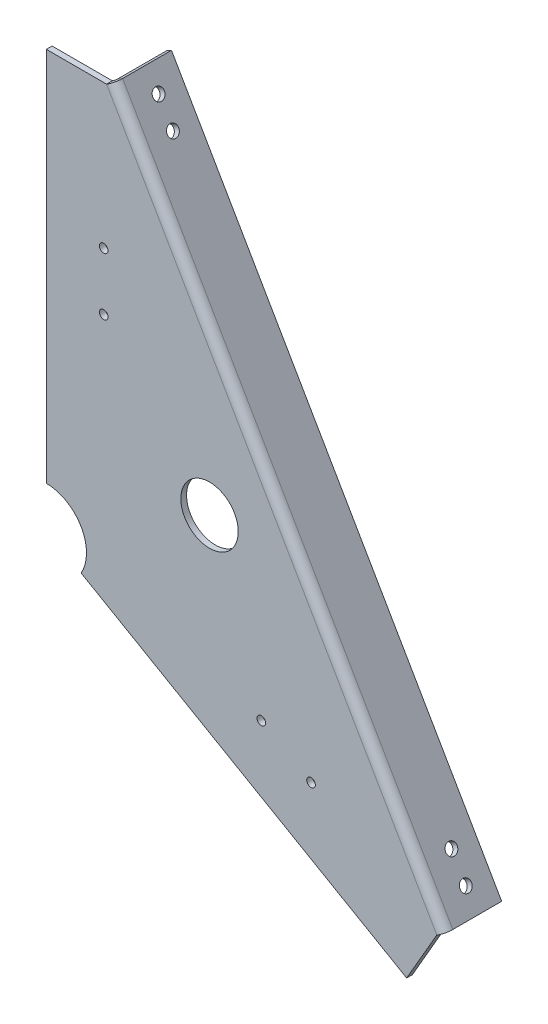
ISO-10303-21;
HEADER;
FILE_DESCRIPTION(('STEP AP214'),'2;1');
FILE_NAME('part.step','',(''),(''),'','','');
FILE_SCHEMA(('AUTOMOTIVE_DESIGN { 1 0 10303 214 1 1 1 1 }'));
ENDSEC;
DATA;
#1=APPLICATION_CONTEXT('core data for automotive mechanical design processes');
#2=APPLICATION_PROTOCOL_DEFINITION('international standard','automotive_design',2000,#1);
#3=PRODUCT_CONTEXT('',#1,'mechanical');
#4=PRODUCT('Part','Part','',(#3));
#5=PRODUCT_RELATED_PRODUCT_CATEGORY('part','',(#4));
#6=PRODUCT_DEFINITION_FORMATION('','',#4);
#7=PRODUCT_DEFINITION_CONTEXT('part definition',#1,'design');
#8=PRODUCT_DEFINITION('design','',#6,#7);
#9=PRODUCT_DEFINITION_SHAPE('','',#8);
#10=(LENGTH_UNIT() NAMED_UNIT(*) SI_UNIT(.MILLI.,.METRE.));
#11=(NAMED_UNIT(*) PLANE_ANGLE_UNIT() SI_UNIT($,.RADIAN.));
#12=(NAMED_UNIT(*) SI_UNIT($,.STERADIAN.) SOLID_ANGLE_UNIT());
#13=UNCERTAINTY_MEASURE_WITH_UNIT(LENGTH_MEASURE(1.E-05),#10,'distance_accuracy_value','');
#14=(GEOMETRIC_REPRESENTATION_CONTEXT(3) GLOBAL_UNCERTAINTY_ASSIGNED_CONTEXT((#13)) GLOBAL_UNIT_ASSIGNED_CONTEXT((#10,
#11,#12)) REPRESENTATION_CONTEXT('',''));
#15=CARTESIAN_POINT('',(0.,0.,0.));
#16=DIRECTION('',(0.,0.,1.));
#17=DIRECTION('',(1.,0.,0.));
#18=AXIS2_PLACEMENT_3D('',#15,#16,#17);
#19=CARTESIAN_POINT('',(93.9999999999978,235.558909829368,-2.));
#20=DIRECTION('',(0.,1.,0.));
#21=DIRECTION('',(-1.,0.,0.));
#22=AXIS2_PLACEMENT_3D('',#19,#20,#21);
#23=PLANE('',#22);
#24=DIRECTION('',(-1.,0.,0.));
#25=VECTOR('',#24,1.);
#26=CARTESIAN_POINT('',(93.9999999999978,235.558909829368,-2.));
#27=LINE('',#26,#25);
#28=CARTESIAN_POINT('',(135.999999999997,235.558909829367,-1.99999999999968));
#29=VERTEX_POINT('',#28);
#30=CARTESIAN_POINT('',(115.008517475188,235.558909829368,-2.));
#31=VERTEX_POINT('',#30);
#32=EDGE_CURVE('E213',#29,#31,#27,.T.);
#33=ORIENTED_EDGE('',*,*,#32,.T.);
#34=DIRECTION('',(0.,0.,1.));
#35=VECTOR('',#34,1.);
#36=CARTESIAN_POINT('',(115.008517475188,235.558909829368,-2.));
#37=LINE('',#36,#35);
#38=CARTESIAN_POINT('',(115.008517475188,235.558909829368,0.));
#39=VERTEX_POINT('',#38);
#40=EDGE_CURVE('E363',#31,#39,#37,.T.);
#41=ORIENTED_EDGE('',*,*,#40,.T.);
#42=DIRECTION('',(-1.,0.,0.));
#43=VECTOR('',#42,1.);
#44=CARTESIAN_POINT('',(93.9999999999978,235.558909829368,0.));
#45=LINE('',#44,#43);
#46=CARTESIAN_POINT('',(135.999999999998,235.558909829367,0.));
#47=VERTEX_POINT('',#46);
#48=EDGE_CURVE('E207',#47,#39,#45,.T.);
#49=ORIENTED_EDGE('',*,*,#48,.F.);
#50=DIRECTION('',(0.,0.,1.));
#51=VECTOR('',#50,1.);
#52=CARTESIAN_POINT('',(135.999999999998,235.558909829367,-2.));
#53=LINE('',#52,#51);
#54=EDGE_CURVE('E220',#29,#47,#53,.T.);
#55=ORIENTED_EDGE('',*,*,#54,.F.);
#56=EDGE_LOOP('',(#33,#41,#49,#55));
#57=FACE_BOUND('',#56,.T.);
#58=ADVANCED_FACE('F101',(#57),#23,.T.);
#59=CARTESIAN_POINT('',(250.999999999999,36.3730669589471,-2.));
#60=DIRECTION('',(0.866025403784455,-0.499999999999971,0.));
#61=DIRECTION('',(0.499999999999971,0.866025403784455,0.));
#62=AXIS2_PLACEMENT_3D('',#59,#60,#61);
#63=PLANE('',#62);
#64=DIRECTION('',(0.499999999999971,0.866025403784455,0.));
#65=VECTOR('',#64,1.);
#66=CARTESIAN_POINT('',(250.999999999999,36.3730669589471,0.));
#67=LINE('',#66,#65);
#68=CARTESIAN_POINT('',(240.504258737599,18.1939098293726,0.));
#69=VERTEX_POINT('',#68);
#70=CARTESIAN_POINT('',(250.999999999998,36.3730669589468,3.17454396103756E-13));
#71=VERTEX_POINT('',#70);
#72=EDGE_CURVE('E190',#69,#71,#67,.T.);
#73=ORIENTED_EDGE('',*,*,#72,.F.);
#74=DIRECTION('',(0.,0.,-1.));
#75=VECTOR('',#74,1.);
#76=CARTESIAN_POINT('',(240.504258737599,18.1939098293726,-2.));
#77=LINE('',#76,#75);
#78=CARTESIAN_POINT('',(240.504258737599,18.1939098293726,-2.));
#79=VERTEX_POINT('',#78);
#80=EDGE_CURVE('E176',#69,#79,#77,.T.);
#81=ORIENTED_EDGE('',*,*,#80,.T.);
#82=DIRECTION('',(0.499999999999971,0.866025403784455,0.));
#83=VECTOR('',#82,1.);
#84=CARTESIAN_POINT('',(250.999999999999,36.3730669589471,-2.));
#85=LINE('',#84,#83);
#86=CARTESIAN_POINT('',(250.999999999999,36.3730669589471,-1.99999999999968));
#87=VERTEX_POINT('',#86);
#88=EDGE_CURVE('E219',#79,#87,#85,.T.);
#89=ORIENTED_EDGE('',*,*,#88,.T.);
#90=DIRECTION('',(0.,0.,1.));
#91=VECTOR('',#90,1.);
#92=CARTESIAN_POINT('',(250.999999999999,36.3730669589471,-2.));
#93=LINE('',#92,#91);
#94=EDGE_CURVE('E200',#87,#71,#93,.T.);
#95=ORIENTED_EDGE('',*,*,#94,.T.);
#96=EDGE_LOOP('',(#73,#81,#89,#95));
#97=FACE_BOUND('',#96,.T.);
#98=ADVANCED_FACE('F103',(#97),#63,.T.);
#99=CARTESIAN_POINT('',(0.,0.,-2.));
#100=DIRECTION('',(0.,0.,-1.));
#101=DIRECTION('',(-1.,0.,0.));
#102=AXIS2_PLACEMENT_3D('',#99,#100,#101);
#103=PLANE('',#102);
#104=CARTESIAN_POINT('',(171.849364905387,123.465988394157,-2.));
#105=DIRECTION('',(0.,0.,1.));
#106=DIRECTION('',(1.,0.,0.));
#107=AXIS2_PLACEMENT_3D('',#104,#105,#106);
#108=CIRCLE('',#107,10.);
#109=CARTESIAN_POINT('',(181.849364905387,123.465988394157,-2.));
#110=VERTEX_POINT('',#109);
#111=EDGE_CURVE('E203',#110,#110,#108,.T.);
#112=ORIENTED_EDGE('',*,*,#111,.T.);
#113=EDGE_LOOP('',(#112));
#114=FACE_BOUND('',#113,.T.);
#115=CARTESIAN_POINT('',(189.878221735088,70.5070415551599,-2.));
#116=DIRECTION('',(0.,0.,-1.));
#117=DIRECTION('',(-1.,0.,0.));
#118=AXIS2_PLACEMENT_3D('',#115,#116,#117);
#119=CIRCLE('',#118,1.50000000000139);
#120=CARTESIAN_POINT('',(188.378221735087,70.5070415551599,-2.));
#121=VERTEX_POINT('',#120);
#122=EDGE_CURVE('E184',#121,#121,#119,.T.);
#123=ORIENTED_EDGE('',*,*,#122,.F.);
#124=EDGE_LOOP('',(#123));
#125=FACE_BOUND('',#124,.T.);
#126=CARTESIAN_POINT('',(207.198729810778,60.5070415551598,-2.));
#127=DIRECTION('',(0.,0.,-1.));
#128=DIRECTION('',(-1.,0.,0.));
#129=AXIS2_PLACEMENT_3D('',#126,#127,#128);
#130=CIRCLE('',#129,1.50000000000002);
#131=CARTESIAN_POINT('',(205.698729810778,60.5070415551598,-2.));
#132=VERTEX_POINT('',#131);
#133=EDGE_CURVE('E376',#132,#132,#130,.T.);
#134=ORIENTED_EDGE('',*,*,#133,.F.);
#135=EDGE_LOOP('',(#134));
#136=FACE_BOUND('',#135,.T.);
#137=CARTESIAN_POINT('',(135.,165.558909829367,-2.));
#138=DIRECTION('',(0.,0.,-1.));
#139=DIRECTION('',(-1.,0.,0.));
#140=AXIS2_PLACEMENT_3D('',#137,#138,#139);
#141=CIRCLE('',#140,1.5);
#142=CARTESIAN_POINT('',(133.5,165.558909829367,-2.));
#143=VERTEX_POINT('',#142);
#144=EDGE_CURVE('E377',#143,#143,#141,.T.);
#145=ORIENTED_EDGE('',*,*,#144,.F.);
#146=EDGE_LOOP('',(#145));
#147=FACE_BOUND('',#146,.T.);
#148=CARTESIAN_POINT('',(135.,185.558909829367,-2.));
#149=DIRECTION('',(0.,0.,-1.));
#150=DIRECTION('',(-1.,0.,0.));
#151=AXIS2_PLACEMENT_3D('',#148,#149,#150);
#152=CIRCLE('',#151,1.5);
#153=CARTESIAN_POINT('',(133.5,185.558909829367,-2.));
#154=VERTEX_POINT('',#153);
#155=EDGE_CURVE('E231',#154,#154,#152,.T.);
#156=ORIENTED_EDGE('',*,*,#155,.F.);
#157=EDGE_LOOP('',(#156));
#158=FACE_BOUND('',#157,.T.);
#159=ORIENTED_EDGE('',*,*,#88,.F.);
#160=DIRECTION('',(-0.866025403784457,0.499999999999968,0.));
#161=VECTOR('',#160,1.);
#162=CARTESIAN_POINT('',(68.0042587375918,117.786831264579,-2.));
#163=LINE('',#162,#161);
#164=CARTESIAN_POINT('',(127.128612146727,83.6513699081551,-2.));
#165=VERTEX_POINT('',#164);
#166=EDGE_CURVE('E179',#79,#165,#163,.T.);
#167=ORIENTED_EDGE('',*,*,#166,.T.);
#168=CARTESIAN_POINT('',(115.,90.643992262771,-2.));
#169=DIRECTION('',(0.,0.,-1.));
#170=DIRECTION('',(-1.,0.,0.));
#171=AXIS2_PLACEMENT_3D('',#168,#169,#170);
#172=CIRCLE('',#171,14.);
#173=CARTESIAN_POINT('',(115.008517475193,104.643989671793,-2.));
#174=VERTEX_POINT('',#173);
#175=EDGE_CURVE('E242',#174,#165,#172,.T.);
#176=ORIENTED_EDGE('',*,*,#175,.F.);
#177=DIRECTION('',(0.,1.,0.));
#178=VECTOR('',#177,1.);
#179=CARTESIAN_POINT('',(115.008517475197,4.01250439725282E-12,-2.));
#180=LINE('',#179,#178);
#181=EDGE_CURVE('E124',#174,#31,#180,.T.);
#182=ORIENTED_EDGE('',*,*,#181,.T.);
#183=ORIENTED_EDGE('',*,*,#32,.F.);
#184=DIRECTION('',(-0.500000000000004,0.866025403784436,0.));
#185=VECTOR('',#184,1.);
#186=CARTESIAN_POINT('',(135.999999999998,235.558909829367,-2.));
#187=LINE('',#186,#185);
#188=EDGE_CURVE('E353',#87,#29,#187,.T.);
#189=ORIENTED_EDGE('',*,*,#188,.F.);
#190=EDGE_LOOP('',(#159,#167,#176,#182,#183,#189));
#191=FACE_BOUND('',#190,.T.);
#192=ADVANCED_FACE('F365',(#114,#125,#136,#147,#158,#191),#103,.T.);
#193=CARTESIAN_POINT('',(0.,0.,0.));
#194=DIRECTION('',(0.,0.,-1.));
#195=DIRECTION('',(-1.,0.,0.));
#196=AXIS2_PLACEMENT_3D('',#193,#194,#195);
#197=PLANE('',#196);
#198=CARTESIAN_POINT('',(171.849364905387,123.465988394157,0.));
#199=DIRECTION('',(0.,0.,1.));
#200=DIRECTION('',(1.,0.,0.));
#201=AXIS2_PLACEMENT_3D('',#198,#199,#200);
#202=CIRCLE('',#201,10.);
#203=CARTESIAN_POINT('',(181.849364905387,123.465988394157,0.));
#204=VERTEX_POINT('',#203);
#205=EDGE_CURVE('E210',#204,#204,#202,.T.);
#206=ORIENTED_EDGE('',*,*,#205,.F.);
#207=EDGE_LOOP('',(#206));
#208=FACE_BOUND('',#207,.T.);
#209=CARTESIAN_POINT('',(189.878221735088,70.5070415551599,0.));
#210=DIRECTION('',(0.,0.,-1.));
#211=DIRECTION('',(-1.,0.,0.));
#212=AXIS2_PLACEMENT_3D('',#209,#210,#211);
#213=CIRCLE('',#212,1.50000000000139);
#214=CARTESIAN_POINT('',(188.378221735087,70.5070415551599,0.));
#215=VERTEX_POINT('',#214);
#216=EDGE_CURVE('E226',#215,#215,#213,.T.);
#217=ORIENTED_EDGE('',*,*,#216,.T.);
#218=EDGE_LOOP('',(#217));
#219=FACE_BOUND('',#218,.T.);
#220=CARTESIAN_POINT('',(207.198729810778,60.5070415551598,0.));
#221=DIRECTION('',(0.,0.,-1.));
#222=DIRECTION('',(-1.,0.,0.));
#223=AXIS2_PLACEMENT_3D('',#220,#221,#222);
#224=CIRCLE('',#223,1.50000000000002);
#225=CARTESIAN_POINT('',(205.698729810778,60.5070415551598,0.));
#226=VERTEX_POINT('',#225);
#227=EDGE_CURVE('E230',#226,#226,#224,.T.);
#228=ORIENTED_EDGE('',*,*,#227,.T.);
#229=EDGE_LOOP('',(#228));
#230=FACE_BOUND('',#229,.T.);
#231=CARTESIAN_POINT('',(135.,165.558909829367,0.));
#232=DIRECTION('',(0.,0.,-1.));
#233=DIRECTION('',(-1.,0.,0.));
#234=AXIS2_PLACEMENT_3D('',#231,#232,#233);
#235=CIRCLE('',#234,1.5);
#236=CARTESIAN_POINT('',(133.5,165.558909829367,0.));
#237=VERTEX_POINT('',#236);
#238=EDGE_CURVE('E235',#237,#237,#235,.T.);
#239=ORIENTED_EDGE('',*,*,#238,.T.);
#240=EDGE_LOOP('',(#239));
#241=FACE_BOUND('',#240,.T.);
#242=CARTESIAN_POINT('',(135.,185.558909829367,0.));
#243=DIRECTION('',(0.,0.,-1.));
#244=DIRECTION('',(-1.,0.,0.));
#245=AXIS2_PLACEMENT_3D('',#242,#243,#244);
#246=CIRCLE('',#245,1.5);
#247=CARTESIAN_POINT('',(133.5,185.558909829367,0.));
#248=VERTEX_POINT('',#247);
#249=EDGE_CURVE('E239',#248,#248,#246,.T.);
#250=ORIENTED_EDGE('',*,*,#249,.T.);
#251=EDGE_LOOP('',(#250));
#252=FACE_BOUND('',#251,.T.);
#253=DIRECTION('',(-0.866025403784457,0.499999999999968,0.));
#254=VECTOR('',#253,1.);
#255=CARTESIAN_POINT('',(244.834385756521,15.6939098293728,0.));
#256=LINE('',#255,#254);
#257=CARTESIAN_POINT('',(127.128612146727,83.6513699081551,0.));
#258=VERTEX_POINT('',#257);
#259=EDGE_CURVE('E116',#69,#258,#256,.T.);
#260=ORIENTED_EDGE('',*,*,#259,.F.);
#261=ORIENTED_EDGE('',*,*,#72,.T.);
#262=DIRECTION('',(-0.500000000000004,0.866025403784436,0.));
#263=VECTOR('',#262,1.);
#264=CARTESIAN_POINT('',(135.999999999998,235.558909829367,0.));
#265=LINE('',#264,#263);
#266=EDGE_CURVE('E202',#71,#47,#265,.T.);
#267=ORIENTED_EDGE('',*,*,#266,.T.);
#268=ORIENTED_EDGE('',*,*,#48,.T.);
#269=DIRECTION('',(0.,1.,0.));
#270=VECTOR('',#269,1.);
#271=CARTESIAN_POINT('',(115.008517475193,90.648909829368,0.));
#272=LINE('',#271,#270);
#273=CARTESIAN_POINT('',(115.008517475193,104.643989671793,0.));
#274=VERTEX_POINT('',#273);
#275=EDGE_CURVE('E196',#274,#39,#272,.T.);
#276=ORIENTED_EDGE('',*,*,#275,.F.);
#277=CARTESIAN_POINT('',(115.,90.643992262771,0.));
#278=DIRECTION('',(0.,0.,-1.));
#279=DIRECTION('',(-1.,0.,0.));
#280=AXIS2_PLACEMENT_3D('',#277,#278,#279);
#281=CIRCLE('',#280,14.);
#282=EDGE_CURVE('E194',#258,#274,#281,.F.);
#283=ORIENTED_EDGE('',*,*,#282,.F.);
#284=EDGE_LOOP('',(#260,#261,#267,#268,#276,#283));
#285=FACE_BOUND('',#284,.T.);
#286=ADVANCED_FACE('F188',(#208,#219,#230,#241,#252,#285),#197,.F.);
#287=CARTESIAN_POINT('',(115.,90.643992262771,0.00100000000031759));
#288=DIRECTION('',(0.,0.,-1.));
#289=DIRECTION('',(-1.,0.,0.));
#290=AXIS2_PLACEMENT_3D('',#287,#288,#289);
#291=CYLINDRICAL_SURFACE('',#290,14.);
#292=DIRECTION('',(0.,0.,-1.));
#293=VECTOR('',#292,1.);
#294=CARTESIAN_POINT('',(127.128612146727,83.6513699081551,0.00100000000031759));
#295=LINE('',#294,#293);
#296=EDGE_CURVE('E13',#258,#165,#295,.T.);
#297=ORIENTED_EDGE('',*,*,#296,.F.);
#298=ORIENTED_EDGE('',*,*,#282,.T.);
#299=DIRECTION('',(0.,0.,-1.));
#300=VECTOR('',#299,1.);
#301=CARTESIAN_POINT('',(115.008517475193,104.643989671793,0.00100000000031759));
#302=LINE('',#301,#300);
#303=EDGE_CURVE('E110',#174,#274,#302,.F.);
#304=ORIENTED_EDGE('',*,*,#303,.F.);
#305=ORIENTED_EDGE('',*,*,#175,.T.);
#306=EDGE_LOOP('',(#297,#298,#304,#305));
#307=FACE_BOUND('',#306,.T.);
#308=ADVANCED_FACE('F252',(#307),#291,.F.);
#309=CARTESIAN_POINT('',(171.849364905387,123.465988394157,-2.));
#310=DIRECTION('',(0.,0.,1.));
#311=DIRECTION('',(1.,0.,0.));
#312=AXIS2_PLACEMENT_3D('',#309,#310,#311);
#313=CYLINDRICAL_SURFACE('',#312,10.);
#314=ORIENTED_EDGE('',*,*,#111,.F.);
#315=EDGE_LOOP('',(#314));
#316=FACE_BOUND('',#315,.T.);
#317=ORIENTED_EDGE('',*,*,#205,.T.);
#318=EDGE_LOOP('',(#317));
#319=FACE_BOUND('',#318,.T.);
#320=ADVANCED_FACE('F428',(#316,#319),#313,.F.);
#321=CARTESIAN_POINT('',(135.999999999997,235.558909829367,-3.00000000000001));
#322=DIRECTION('',(-0.500000000000007,0.866025403784435,0.));
#323=DIRECTION('',(-0.866025403784435,-0.500000000000007,0.));
#324=AXIS2_PLACEMENT_3D('',#321,#322,#323);
#325=PLANE('',#324);
#326=DIRECTION('',(-0.866025403784436,-0.500000000000004,0.));
#327=VECTOR('',#326,1.);
#328=CARTESIAN_POINT('',(138.598076211351,237.058909829367,-3.));
#329=LINE('',#328,#327);
#330=CARTESIAN_POINT('',(136.866025403782,236.058909829367,-3.));
#331=VERTEX_POINT('',#330);
#332=CARTESIAN_POINT('',(138.598076211351,237.058909829368,-3.));
#333=VERTEX_POINT('',#332);
#334=EDGE_CURVE('E273',#331,#333,#329,.F.);
#335=ORIENTED_EDGE('',*,*,#334,.F.);
#336=CARTESIAN_POINT('',(135.999999999997,235.558909829367,-3.00000000000001));
#337=DIRECTION('',(0.500000000000007,-0.866025403784435,0.));
#338=DIRECTION('',(0.866025403784435,0.500000000000007,0.));
#339=AXIS2_PLACEMENT_3D('',#336,#337,#338);
#340=CIRCLE('',#339,1.00000000000032);
#341=EDGE_CURVE('E342',#29,#331,#340,.F.);
#342=ORIENTED_EDGE('',*,*,#341,.F.);
#343=ORIENTED_EDGE('',*,*,#54,.T.);
#344=CARTESIAN_POINT('',(135.999999999997,235.558909829367,-3.00000000000001));
#345=DIRECTION('',(0.500000000000007,-0.866025403784435,0.));
#346=DIRECTION('',(0.866025403784435,0.500000000000007,0.));
#347=AXIS2_PLACEMENT_3D('',#344,#345,#346);
#348=CIRCLE('',#347,3.00000000000032);
#349=EDGE_CURVE('E334',#47,#333,#348,.F.);
#350=ORIENTED_EDGE('',*,*,#349,.T.);
#351=EDGE_LOOP('',(#335,#342,#343,#350));
#352=FACE_BOUND('',#351,.T.);
#353=ADVANCED_FACE('F510',(#352),#325,.T.);
#354=CARTESIAN_POINT('',(250.999999999999,36.3730669589472,-3.00000000000001));
#355=DIRECTION('',(-0.500000000000007,0.866025403784435,0.));
#356=DIRECTION('',(-0.866025403784435,-0.500000000000007,0.));
#357=AXIS2_PLACEMENT_3D('',#354,#355,#356);
#358=PLANE('',#357);
#359=CARTESIAN_POINT('',(250.999999999999,36.3730669589472,-3.00000000000001));
#360=DIRECTION('',(0.500000000000007,-0.866025403784435,0.));
#361=DIRECTION('',(0.866025403784435,0.500000000000007,0.));
#362=AXIS2_PLACEMENT_3D('',#359,#360,#361);
#363=CIRCLE('',#362,1.00000000000032);
#364=CARTESIAN_POINT('',(251.866025403784,36.8730669589474,-3.));
#365=VERTEX_POINT('',#364);
#366=EDGE_CURVE('E296',#365,#87,#363,.T.);
#367=ORIENTED_EDGE('',*,*,#366,.F.);
#368=DIRECTION('',(-0.866025403784436,-0.500000000000004,0.));
#369=VECTOR('',#368,1.);
#370=CARTESIAN_POINT('',(251.866025403783,36.8730669589471,-3.));
#371=LINE('',#370,#369);
#372=CARTESIAN_POINT('',(253.598076211352,37.8730669589471,-3.));
#373=VERTEX_POINT('',#372);
#374=EDGE_CURVE('E324',#365,#373,#371,.F.);
#375=ORIENTED_EDGE('',*,*,#374,.T.);
#376=CARTESIAN_POINT('',(250.999999999999,36.3730669589473,-3.00000000000001));
#377=DIRECTION('',(0.500000000000007,-0.866025403784435,0.));
#378=DIRECTION('',(0.866025403784435,0.500000000000007,0.));
#379=AXIS2_PLACEMENT_3D('',#376,#377,#378);
#380=CIRCLE('',#379,3.00000000000032);
#381=EDGE_CURVE('E338',#373,#71,#380,.T.);
#382=ORIENTED_EDGE('',*,*,#381,.T.);
#383=ORIENTED_EDGE('',*,*,#94,.F.);
#384=EDGE_LOOP('',(#367,#375,#382,#383));
#385=FACE_BOUND('',#384,.T.);
#386=ADVANCED_FACE('F506',(#385),#358,.F.);
#387=CARTESIAN_POINT('',(250.999999999999,36.3730669589472,-3.00000000000001));
#388=DIRECTION('',(0.500000000000007,-0.866025403784435,0.));
#389=DIRECTION('',(0.866025403784435,0.500000000000007,0.));
#390=AXIS2_PLACEMENT_3D('',#387,#388,#389);
#391=CYLINDRICAL_SURFACE('',#390,3.00000000000032);
#392=ORIENTED_EDGE('',*,*,#266,.F.);
#393=ORIENTED_EDGE('',*,*,#381,.F.);
#394=DIRECTION('',(0.500000000000004,-0.866025403784436,0.));
#395=VECTOR('',#394,1.);
#396=CARTESIAN_POINT('',(138.598076211351,237.058909829367,-3.));
#397=LINE('',#396,#395);
#398=EDGE_CURVE('E321',#373,#333,#397,.F.);
#399=ORIENTED_EDGE('',*,*,#398,.T.);
#400=ORIENTED_EDGE('',*,*,#349,.F.);
#401=EDGE_LOOP('',(#392,#393,#399,#400));
#402=FACE_BOUND('',#401,.T.);
#403=ADVANCED_FACE('F503',(#402),#391,.T.);
#404=CARTESIAN_POINT('',(250.999999999999,36.3730669589472,-3.00000000000001));
#405=DIRECTION('',(0.500000000000007,-0.866025403784435,0.));
#406=DIRECTION('',(0.866025403784435,0.500000000000007,0.));
#407=AXIS2_PLACEMENT_3D('',#404,#405,#406);
#408=CYLINDRICAL_SURFACE('',#407,1.00000000000032);
#409=ORIENTED_EDGE('',*,*,#188,.T.);
#410=ORIENTED_EDGE('',*,*,#341,.T.);
#411=DIRECTION('',(0.500000000000004,-0.866025403784436,0.));
#412=VECTOR('',#411,1.);
#413=CARTESIAN_POINT('',(136.866025403782,236.058909829367,-3.));
#414=LINE('',#413,#412);
#415=EDGE_CURVE('E328',#331,#365,#414,.T.);
#416=ORIENTED_EDGE('',*,*,#415,.T.);
#417=ORIENTED_EDGE('',*,*,#366,.T.);
#418=EDGE_LOOP('',(#409,#410,#416,#417));
#419=FACE_BOUND('',#418,.T.);
#420=ADVANCED_FACE('F501',(#419),#408,.F.);
#421=CARTESIAN_POINT('',(253.598076211352,37.8730669589469,-20.));
#422=DIRECTION('',(-0.500000000000004,0.866025403784436,0.));
#423=DIRECTION('',(-0.866025403784436,-0.500000000000004,0.));
#424=AXIS2_PLACEMENT_3D('',#421,#422,#423);
#425=PLANE('',#424);
#426=ORIENTED_EDGE('',*,*,#374,.F.);
#427=DIRECTION('',(0.,0.,1.));
#428=VECTOR('',#427,1.);
#429=CARTESIAN_POINT('',(251.866025403783,36.8730669589469,-20.));
#430=LINE('',#429,#428);
#431=CARTESIAN_POINT('',(251.866025403783,36.8730669589469,-20.));
#432=VERTEX_POINT('',#431);
#433=EDGE_CURVE('E318',#365,#432,#430,.F.);
#434=ORIENTED_EDGE('',*,*,#433,.T.);
#435=DIRECTION('',(-0.866025403784436,-0.500000000000004,0.));
#436=VECTOR('',#435,1.);
#437=CARTESIAN_POINT('',(253.598076211352,37.8730669589469,-20.));
#438=LINE('',#437,#436);
#439=CARTESIAN_POINT('',(253.598076211352,37.8730669589469,-20.));
#440=VERTEX_POINT('',#439);
#441=EDGE_CURVE('E292',#440,#432,#438,.T.);
#442=ORIENTED_EDGE('',*,*,#441,.F.);
#443=DIRECTION('',(0.,0.,-1.));
#444=VECTOR('',#443,1.);
#445=CARTESIAN_POINT('',(253.598076211352,37.8730669589471,1.99268098573483E-12));
#446=LINE('',#445,#444);
#447=EDGE_CURVE('E308',#373,#440,#446,.T.);
#448=ORIENTED_EDGE('',*,*,#447,.F.);
#449=EDGE_LOOP('',(#426,#434,#442,#448));
#450=FACE_BOUND('',#449,.T.);
#451=ADVANCED_FACE('F494',(#450),#425,.F.);
#452=CARTESIAN_POINT('',(138.598076211351,237.058909829367,-1.99999999999999));
#453=DIRECTION('',(0.500000000000004,-0.866025403784436,0.));
#454=DIRECTION('',(0.866025403784436,0.500000000000004,0.));
#455=AXIS2_PLACEMENT_3D('',#452,#453,#454);
#456=PLANE('',#455);
#457=ORIENTED_EDGE('',*,*,#334,.T.);
#458=DIRECTION('',(0.,0.,1.));
#459=VECTOR('',#458,1.);
#460=CARTESIAN_POINT('',(138.598076211351,237.058909829367,7.76587597985664E-13));
#461=LINE('',#460,#459);
#462=CARTESIAN_POINT('',(138.598076211351,237.058909829367,-20.));
#463=VERTEX_POINT('',#462);
#464=EDGE_CURVE('E301',#463,#333,#461,.T.);
#465=ORIENTED_EDGE('',*,*,#464,.F.);
#466=DIRECTION('',(-0.866025403784436,-0.500000000000004,0.));
#467=VECTOR('',#466,1.);
#468=CARTESIAN_POINT('',(138.598076211351,237.058909829367,-20.));
#469=LINE('',#468,#467);
#470=CARTESIAN_POINT('',(136.866025403782,236.058909829367,-20.));
#471=VERTEX_POINT('',#470);
#472=EDGE_CURVE('E297',#463,#471,#469,.T.);
#473=ORIENTED_EDGE('',*,*,#472,.T.);
#474=DIRECTION('',(0.,0.,-1.));
#475=VECTOR('',#474,1.);
#476=CARTESIAN_POINT('',(136.866025403782,236.058909829367,-2.));
#477=LINE('',#476,#475);
#478=EDGE_CURVE('E311',#471,#331,#477,.F.);
#479=ORIENTED_EDGE('',*,*,#478,.T.);
#480=EDGE_LOOP('',(#457,#465,#473,#479));
#481=FACE_BOUND('',#480,.T.);
#482=ADVANCED_FACE('F487',(#481),#456,.F.);
#483=CARTESIAN_POINT('',(206.598076211352,119.279454914684,8.04683248923081E-13));
#484=DIRECTION('',(-0.866025403784436,-0.500000000000004,0.));
#485=DIRECTION('',(0.500000000000004,-0.866025403784436,0.));
#486=AXIS2_PLACEMENT_3D('',#483,#484,#485);
#487=PLANE('',#486);
#488=CARTESIAN_POINT('',(249.598076211352,44.8012701892222,-11.5));
#489=DIRECTION('',(0.866025403784436,0.500000000000005,0.));
#490=DIRECTION('',(-0.500000000000005,0.866025403784436,0.));
#491=AXIS2_PLACEMENT_3D('',#488,#489,#490);
#492=CIRCLE('',#491,2.);
#493=CARTESIAN_POINT('',(248.598076211352,46.5333209967911,-11.5));
#494=VERTEX_POINT('',#493);
#495=EDGE_CURVE('E268',#494,#494,#492,.T.);
#496=ORIENTED_EDGE('',*,*,#495,.F.);
#497=EDGE_LOOP('',(#496));
#498=FACE_BOUND('',#497,.T.);
#499=CARTESIAN_POINT('',(244.598076211352,53.4615242270666,-11.5));
#500=DIRECTION('',(0.866025403784436,0.500000000000005,0.));
#501=DIRECTION('',(-0.500000000000005,0.866025403784436,0.));
#502=AXIS2_PLACEMENT_3D('',#499,#500,#501);
#503=CIRCLE('',#502,2.);
#504=CARTESIAN_POINT('',(243.598076211352,55.1935750346355,-11.5));
#505=VERTEX_POINT('',#504);
#506=EDGE_CURVE('E269',#505,#505,#503,.T.);
#507=ORIENTED_EDGE('',*,*,#506,.F.);
#508=EDGE_LOOP('',(#507));
#509=FACE_BOUND('',#508,.T.);
#510=CARTESIAN_POINT('',(147.598076211352,221.470452561246,-11.5));
#511=DIRECTION('',(0.866025403784436,0.500000000000005,0.));
#512=DIRECTION('',(-0.500000000000005,0.866025403784436,0.));
#513=AXIS2_PLACEMENT_3D('',#510,#511,#512);
#514=CIRCLE('',#513,2.00000000000001);
#515=CARTESIAN_POINT('',(146.598076211352,223.202503368815,-11.5));
#516=VERTEX_POINT('',#515);
#517=EDGE_CURVE('E278',#516,#516,#514,.T.);
#518=ORIENTED_EDGE('',*,*,#517,.F.);
#519=EDGE_LOOP('',(#518));
#520=FACE_BOUND('',#519,.T.);
#521=CARTESIAN_POINT('',(142.598076211352,230.130706599091,-11.5));
#522=DIRECTION('',(0.866025403784436,0.500000000000005,0.));
#523=DIRECTION('',(-0.500000000000005,0.866025403784436,0.));
#524=AXIS2_PLACEMENT_3D('',#521,#522,#523);
#525=CIRCLE('',#524,2.);
#526=CARTESIAN_POINT('',(141.598076211352,231.862757406659,-11.5));
#527=VERTEX_POINT('',#526);
#528=EDGE_CURVE('E259',#527,#527,#525,.T.);
#529=ORIENTED_EDGE('',*,*,#528,.F.);
#530=EDGE_LOOP('',(#529));
#531=FACE_BOUND('',#530,.T.);
#532=ORIENTED_EDGE('',*,*,#398,.F.);
#533=ORIENTED_EDGE('',*,*,#447,.T.);
#534=DIRECTION('',(-0.500000000000004,0.866025403784436,0.));
#535=VECTOR('',#534,1.);
#536=CARTESIAN_POINT('',(206.598076211352,119.279454914684,-20.));
#537=LINE('',#536,#535);
#538=EDGE_CURVE('E305',#440,#463,#537,.T.);
#539=ORIENTED_EDGE('',*,*,#538,.T.);
#540=ORIENTED_EDGE('',*,*,#464,.T.);
#541=EDGE_LOOP('',(#532,#533,#539,#540));
#542=FACE_BOUND('',#541,.T.);
#543=ADVANCED_FACE('F483',(#498,#509,#520,#531,#542),#487,.F.);
#544=CARTESIAN_POINT('',(204.866025403783,118.279454914684,7.97700286245395E-13));
#545=DIRECTION('',(-0.866025403784436,-0.500000000000004,0.));
#546=DIRECTION('',(0.500000000000004,-0.866025403784436,0.));
#547=AXIS2_PLACEMENT_3D('',#544,#545,#546);
#548=PLANE('',#547);
#549=CARTESIAN_POINT('',(247.866025403784,43.8012701892222,-11.5));
#550=DIRECTION('',(-0.866025403784436,-0.500000000000004,0.));
#551=DIRECTION('',(0.500000000000004,-0.866025403784436,0.));
#552=AXIS2_PLACEMENT_3D('',#549,#550,#551);
#553=CIRCLE('',#552,2.);
#554=CARTESIAN_POINT('',(248.866025403784,42.0692193816533,-11.5));
#555=VERTEX_POINT('',#554);
#556=EDGE_CURVE('E264',#555,#555,#553,.F.);
#557=ORIENTED_EDGE('',*,*,#556,.T.);
#558=EDGE_LOOP('',(#557));
#559=FACE_BOUND('',#558,.T.);
#560=CARTESIAN_POINT('',(242.866025403783,52.4615242270666,-11.5));
#561=DIRECTION('',(-0.866025403784436,-0.500000000000004,0.));
#562=DIRECTION('',(0.500000000000004,-0.866025403784436,0.));
#563=AXIS2_PLACEMENT_3D('',#560,#561,#562);
#564=CIRCLE('',#563,2.);
#565=CARTESIAN_POINT('',(243.866025403783,50.7294734194977,-11.5));
#566=VERTEX_POINT('',#565);
#567=EDGE_CURVE('E274',#566,#566,#564,.F.);
#568=ORIENTED_EDGE('',*,*,#567,.T.);
#569=EDGE_LOOP('',(#568));
#570=FACE_BOUND('',#569,.T.);
#571=CARTESIAN_POINT('',(145.866025403783,220.470452561246,-11.5));
#572=DIRECTION('',(-0.866025403784436,-0.500000000000004,0.));
#573=DIRECTION('',(0.500000000000004,-0.866025403784436,0.));
#574=AXIS2_PLACEMENT_3D('',#571,#572,#573);
#575=CIRCLE('',#574,2.00000000000001);
#576=CARTESIAN_POINT('',(146.866025403783,218.738401753677,-11.5));
#577=VERTEX_POINT('',#576);
#578=EDGE_CURVE('E285',#577,#577,#575,.F.);
#579=ORIENTED_EDGE('',*,*,#578,.T.);
#580=EDGE_LOOP('',(#579));
#581=FACE_BOUND('',#580,.T.);
#582=CARTESIAN_POINT('',(140.866025403783,229.130706599091,-11.5));
#583=DIRECTION('',(-0.866025403784436,-0.500000000000004,0.));
#584=DIRECTION('',(0.500000000000004,-0.866025403784436,0.));
#585=AXIS2_PLACEMENT_3D('',#582,#583,#584);
#586=CIRCLE('',#585,2.);
#587=CARTESIAN_POINT('',(141.866025403783,227.398655791522,-11.5));
#588=VERTEX_POINT('',#587);
#589=EDGE_CURVE('E254',#588,#588,#586,.F.);
#590=ORIENTED_EDGE('',*,*,#589,.T.);
#591=EDGE_LOOP('',(#590));
#592=FACE_BOUND('',#591,.T.);
#593=ORIENTED_EDGE('',*,*,#433,.F.);
#594=ORIENTED_EDGE('',*,*,#415,.F.);
#595=ORIENTED_EDGE('',*,*,#478,.F.);
#596=DIRECTION('',(0.500000000000004,-0.866025403784436,0.));
#597=VECTOR('',#596,1.);
#598=CARTESIAN_POINT('',(136.866025403782,236.058909829367,-20.));
#599=LINE('',#598,#597);
#600=EDGE_CURVE('E315',#432,#471,#599,.F.);
#601=ORIENTED_EDGE('',*,*,#600,.F.);
#602=EDGE_LOOP('',(#593,#594,#595,#601));
#603=FACE_BOUND('',#602,.T.);
#604=ADVANCED_FACE('F486',(#559,#570,#581,#592,#603),#548,.T.);
#605=CARTESIAN_POINT('',(138.598076211351,237.058909829367,-20.));
#606=DIRECTION('',(0.,0.,1.));
#607=DIRECTION('',(1.,0.,0.));
#608=AXIS2_PLACEMENT_3D('',#605,#606,#607);
#609=PLANE('',#608);
#610=ORIENTED_EDGE('',*,*,#600,.T.);
#611=ORIENTED_EDGE('',*,*,#472,.F.);
#612=ORIENTED_EDGE('',*,*,#538,.F.);
#613=ORIENTED_EDGE('',*,*,#441,.T.);
#614=EDGE_LOOP('',(#610,#611,#612,#613));
#615=FACE_BOUND('',#614,.T.);
#616=ADVANCED_FACE('F481',(#615),#609,.F.);
#617=CARTESIAN_POINT('',(-82.9987782768935,99.8823019319676,-11.5000000000008));
#618=DIRECTION('',(0.866025403784436,0.500000000000005,0.));
#619=DIRECTION('',(-0.500000000000005,0.866025403784436,0.));
#620=AXIS2_PLACEMENT_3D('',#617,#618,#619);
#621=CYLINDRICAL_SURFACE('',#620,2.);
#622=ORIENTED_EDGE('',*,*,#589,.F.);
#623=EDGE_LOOP('',(#622));
#624=FACE_BOUND('',#623,.T.);
#625=ORIENTED_EDGE('',*,*,#528,.T.);
#626=EDGE_LOOP('',(#625));
#627=FACE_BOUND('',#626,.T.);
#628=ADVANCED_FACE('F477',(#624,#627),#621,.F.);
#629=CARTESIAN_POINT('',(-77.9987782768935,91.2220478941233,-11.5000000000008));
#630=DIRECTION('',(0.866025403784436,0.500000000000005,0.));
#631=DIRECTION('',(-0.500000000000005,0.866025403784436,0.));
#632=AXIS2_PLACEMENT_3D('',#629,#630,#631);
#633=CYLINDRICAL_SURFACE('',#632,2.00000000000001);
#634=ORIENTED_EDGE('',*,*,#578,.F.);
#635=EDGE_LOOP('',(#634));
#636=FACE_BOUND('',#635,.T.);
#637=ORIENTED_EDGE('',*,*,#517,.T.);
#638=EDGE_LOOP('',(#637));
#639=FACE_BOUND('',#638,.T.);
#640=ADVANCED_FACE('F473',(#636,#639),#633,.F.);
#641=CARTESIAN_POINT('',(19.0012217231069,-76.7868804400564,-11.5000000000008));
#642=DIRECTION('',(0.866025403784436,0.500000000000005,0.));
#643=DIRECTION('',(-0.500000000000005,0.866025403784436,0.));
#644=AXIS2_PLACEMENT_3D('',#641,#642,#643);
#645=CYLINDRICAL_SURFACE('',#644,2.);
#646=ORIENTED_EDGE('',*,*,#567,.F.);
#647=EDGE_LOOP('',(#646));
#648=FACE_BOUND('',#647,.T.);
#649=ORIENTED_EDGE('',*,*,#506,.T.);
#650=EDGE_LOOP('',(#649));
#651=FACE_BOUND('',#650,.T.);
#652=ADVANCED_FACE('F469',(#648,#651),#645,.F.);
#653=CARTESIAN_POINT('',(24.0012217231069,-85.4471344779007,-11.5000000000008));
#654=DIRECTION('',(0.866025403784436,0.500000000000005,0.));
#655=DIRECTION('',(-0.500000000000005,0.866025403784436,0.));
#656=AXIS2_PLACEMENT_3D('',#653,#654,#655);
#657=CYLINDRICAL_SURFACE('',#656,2.);
#658=ORIENTED_EDGE('',*,*,#556,.F.);
#659=EDGE_LOOP('',(#658));
#660=FACE_BOUND('',#659,.T.);
#661=ORIENTED_EDGE('',*,*,#495,.T.);
#662=EDGE_LOOP('',(#661));
#663=FACE_BOUND('',#662,.T.);
#664=ADVANCED_FACE('F457',(#660,#663),#657,.F.);
#665=CARTESIAN_POINT('',(189.878221735088,70.5070415551599,8.));
#666=DIRECTION('',(0.,0.,-1.));
#667=DIRECTION('',(-1.,0.,0.));
#668=AXIS2_PLACEMENT_3D('',#665,#666,#667);
#669=CYLINDRICAL_SURFACE('',#668,1.50000000000139);
#670=ORIENTED_EDGE('',*,*,#122,.T.);
#671=EDGE_LOOP('',(#670));
#672=FACE_BOUND('',#671,.T.);
#673=ORIENTED_EDGE('',*,*,#216,.F.);
#674=EDGE_LOOP('',(#673));
#675=FACE_BOUND('',#674,.T.);
#676=ADVANCED_FACE('F453',(#672,#675),#669,.F.);
#677=CARTESIAN_POINT('',(207.198729810778,60.5070415551598,8.));
#678=DIRECTION('',(0.,0.,-1.));
#679=DIRECTION('',(-1.,0.,0.));
#680=AXIS2_PLACEMENT_3D('',#677,#678,#679);
#681=CYLINDRICAL_SURFACE('',#680,1.50000000000002);
#682=ORIENTED_EDGE('',*,*,#133,.T.);
#683=EDGE_LOOP('',(#682));
#684=FACE_BOUND('',#683,.T.);
#685=ORIENTED_EDGE('',*,*,#227,.F.);
#686=EDGE_LOOP('',(#685));
#687=FACE_BOUND('',#686,.T.);
#688=ADVANCED_FACE('F456',(#684,#687),#681,.F.);
#689=CARTESIAN_POINT('',(135.,165.558909829367,8.));
#690=DIRECTION('',(0.,0.,-1.));
#691=DIRECTION('',(-1.,0.,0.));
#692=AXIS2_PLACEMENT_3D('',#689,#690,#691);
#693=CYLINDRICAL_SURFACE('',#692,1.5);
#694=ORIENTED_EDGE('',*,*,#144,.T.);
#695=EDGE_LOOP('',(#694));
#696=FACE_BOUND('',#695,.T.);
#697=ORIENTED_EDGE('',*,*,#238,.F.);
#698=EDGE_LOOP('',(#697));
#699=FACE_BOUND('',#698,.T.);
#700=ADVANCED_FACE('F459',(#696,#699),#693,.F.);
#701=CARTESIAN_POINT('',(135.,185.558909829367,8.));
#702=DIRECTION('',(0.,0.,-1.));
#703=DIRECTION('',(-1.,0.,0.));
#704=AXIS2_PLACEMENT_3D('',#701,#702,#703);
#705=CYLINDRICAL_SURFACE('',#704,1.5);
#706=ORIENTED_EDGE('',*,*,#155,.T.);
#707=EDGE_LOOP('',(#706));
#708=FACE_BOUND('',#707,.T.);
#709=ORIENTED_EDGE('',*,*,#249,.F.);
#710=EDGE_LOOP('',(#709));
#711=FACE_BOUND('',#710,.T.);
#712=ADVANCED_FACE('F387',(#708,#711),#705,.F.);
#713=CARTESIAN_POINT('',(115.008517475193,90.648909829368,0.));
#714=DIRECTION('',(-1.,0.,0.));
#715=DIRECTION('',(0.,-1.,0.));
#716=AXIS2_PLACEMENT_3D('',#713,#714,#715);
#717=PLANE('',#716);
#718=ORIENTED_EDGE('',*,*,#181,.F.);
#719=ORIENTED_EDGE('',*,*,#303,.T.);
#720=ORIENTED_EDGE('',*,*,#275,.T.);
#721=ORIENTED_EDGE('',*,*,#40,.F.);
#722=EDGE_LOOP('',(#718,#719,#720,#721));
#723=FACE_BOUND('',#722,.T.);
#724=ADVANCED_FACE('F244',(#723),#717,.T.);
#725=CARTESIAN_POINT('',(244.834385756521,15.6939098293728,0.));
#726=DIRECTION('',(-0.499999999999968,-0.866025403784457,0.));
#727=DIRECTION('',(0.866025403784457,-0.499999999999968,0.));
#728=AXIS2_PLACEMENT_3D('',#725,#726,#727);
#729=PLANE('',#728);
#730=ORIENTED_EDGE('',*,*,#259,.T.);
#731=ORIENTED_EDGE('',*,*,#296,.T.);
#732=ORIENTED_EDGE('',*,*,#166,.F.);
#733=ORIENTED_EDGE('',*,*,#80,.F.);
#734=EDGE_LOOP('',(#730,#731,#732,#733));
#735=FACE_BOUND('',#734,.T.);
#736=ADVANCED_FACE('F177',(#735),#729,.T.);
#737=CLOSED_SHELL('',(#58,#98,#192,#286,#308,#320,#353,#386,#403,#420,#451,#482,#543,#604,#616,
#628,#640,#652,#664,#676,#688,#700,#712,#724,#736));
#738=MANIFOLD_SOLID_BREP('B2',#737);
#739=ADVANCED_BREP_SHAPE_REPRESENTATION('',(#18,#738),#14);
#740=SHAPE_DEFINITION_REPRESENTATION(#9,#739);
ENDSEC;
END-ISO-10303-21;
